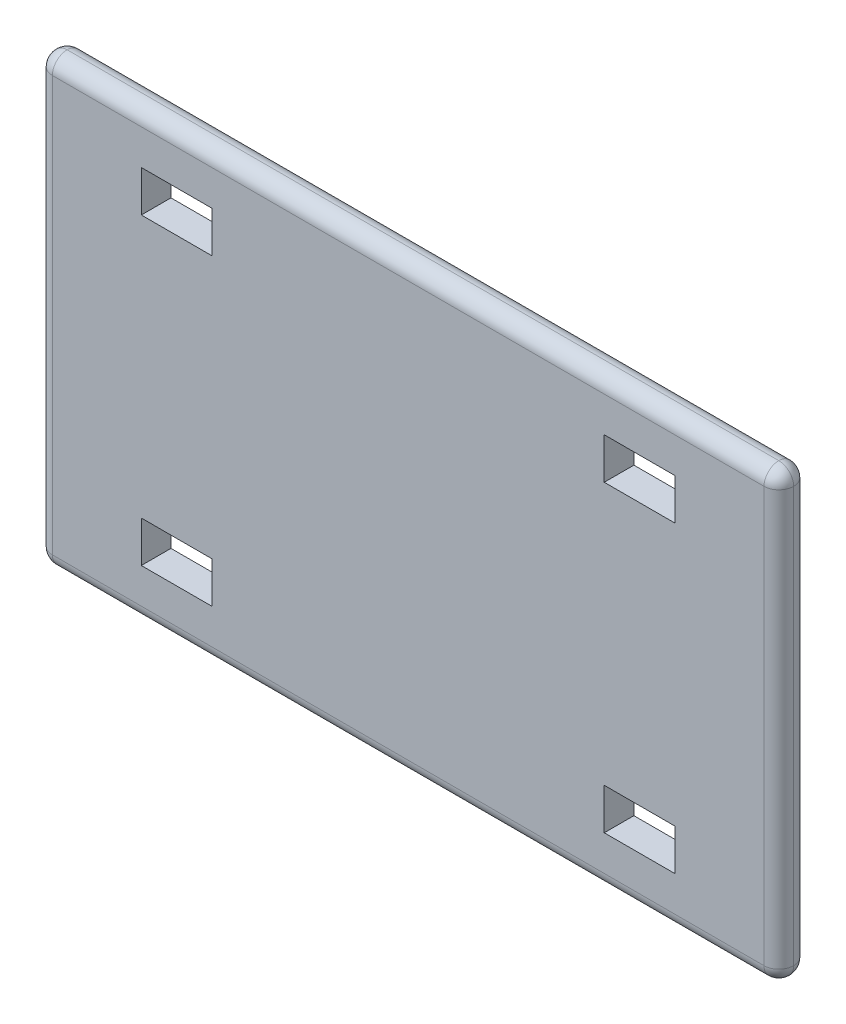
ISO-10303-21;
HEADER;
FILE_DESCRIPTION(('STEP AP214'),'2;1');
FILE_NAME('part.step','',(''),(''),'','','');
FILE_SCHEMA(('AUTOMOTIVE_DESIGN { 1 0 10303 214 1 1 1 1 }'));
ENDSEC;
DATA;
#1=APPLICATION_CONTEXT('core data for automotive mechanical design processes');
#2=APPLICATION_PROTOCOL_DEFINITION('international standard','automotive_design',2000,#1);
#3=PRODUCT_CONTEXT('',#1,'mechanical');
#4=PRODUCT('Part','Part','',(#3));
#5=PRODUCT_RELATED_PRODUCT_CATEGORY('part','',(#4));
#6=PRODUCT_DEFINITION_FORMATION('','',#4);
#7=PRODUCT_DEFINITION_CONTEXT('part definition',#1,'design');
#8=PRODUCT_DEFINITION('design','',#6,#7);
#9=PRODUCT_DEFINITION_SHAPE('','',#8);
#10=(LENGTH_UNIT() NAMED_UNIT(*) SI_UNIT(.MILLI.,.METRE.));
#11=(NAMED_UNIT(*) PLANE_ANGLE_UNIT() SI_UNIT($,.RADIAN.));
#12=(NAMED_UNIT(*) SI_UNIT($,.STERADIAN.) SOLID_ANGLE_UNIT());
#13=UNCERTAINTY_MEASURE_WITH_UNIT(LENGTH_MEASURE(1.E-05),#10,'distance_accuracy_value','');
#14=(GEOMETRIC_REPRESENTATION_CONTEXT(3) GLOBAL_UNCERTAINTY_ASSIGNED_CONTEXT((#13)) GLOBAL_UNIT_ASSIGNED_CONTEXT((#10,
#11,#12)) REPRESENTATION_CONTEXT('',''));
#15=CARTESIAN_POINT('',(0.,0.,0.));
#16=DIRECTION('',(0.,0.,1.));
#17=DIRECTION('',(1.,0.,0.));
#18=AXIS2_PLACEMENT_3D('',#15,#16,#17);
#19=CARTESIAN_POINT('',(0.,0.,0.8));
#20=DIRECTION('',(0.,0.,1.));
#21=DIRECTION('',(1.,0.,0.));
#22=AXIS2_PLACEMENT_3D('',#19,#20,#21);
#23=PLANE('',#22);
#24=DIRECTION('',(-1.,0.,0.));
#25=VECTOR('',#24,1.);
#26=CARTESIAN_POINT('',(6.25703296703297,-6.1445054945055,0.8));
#27=LINE('',#26,#25);
#28=CARTESIAN_POINT('',(8.16703296703297,-6.1445054945055,0.8));
#29=VERTEX_POINT('',#28);
#30=CARTESIAN_POINT('',(6.25703296703297,-6.1445054945055,0.8));
#31=VERTEX_POINT('',#30);
#32=EDGE_CURVE('E301',#29,#31,#27,.T.);
#33=ORIENTED_EDGE('',*,*,#32,.T.);
#34=DIRECTION('',(0.,1.,0.));
#35=VECTOR('',#34,1.);
#36=CARTESIAN_POINT('',(6.25703296703297,-5.0345054945055,0.8));
#37=LINE('',#36,#35);
#38=CARTESIAN_POINT('',(6.25703296703297,-5.0345054945055,0.8));
#39=VERTEX_POINT('',#38);
#40=EDGE_CURVE('E305',#31,#39,#37,.T.);
#41=ORIENTED_EDGE('',*,*,#40,.T.);
#42=DIRECTION('',(1.,0.,0.));
#43=VECTOR('',#42,1.);
#44=CARTESIAN_POINT('',(8.16703296703297,-5.0345054945055,0.8));
#45=LINE('',#44,#43);
#46=CARTESIAN_POINT('',(8.16703296703297,-5.0345054945055,0.8));
#47=VERTEX_POINT('',#46);
#48=EDGE_CURVE('E57',#39,#47,#45,.T.);
#49=ORIENTED_EDGE('',*,*,#48,.T.);
#50=DIRECTION('',(0.,-1.,0.));
#51=VECTOR('',#50,1.);
#52=CARTESIAN_POINT('',(8.16703296703297,-6.1445054945055,0.8));
#53=LINE('',#52,#51);
#54=EDGE_CURVE('E312',#47,#29,#53,.T.);
#55=ORIENTED_EDGE('',*,*,#54,.T.);
#56=EDGE_LOOP('',(#33,#41,#49,#55));
#57=FACE_BOUND('',#56,.T.);
#58=DIRECTION('',(0.,1.,0.));
#59=VECTOR('',#58,1.);
#60=CARTESIAN_POINT('',(-6.23296703296703,-5.0345054945055,0.8));
#61=LINE('',#60,#59);
#62=CARTESIAN_POINT('',(-6.23296703296703,-6.1445054945055,0.8));
#63=VERTEX_POINT('',#62);
#64=CARTESIAN_POINT('',(-6.23296703296703,-5.0345054945055,0.8));
#65=VERTEX_POINT('',#64);
#66=EDGE_CURVE('E259',#63,#65,#61,.T.);
#67=ORIENTED_EDGE('',*,*,#66,.T.);
#68=DIRECTION('',(1.,0.,0.));
#69=VECTOR('',#68,1.);
#70=CARTESIAN_POINT('',(-4.32296703296703,-5.0345054945055,0.8));
#71=LINE('',#70,#69);
#72=CARTESIAN_POINT('',(-4.32296703296703,-5.0345054945055,0.8));
#73=VERTEX_POINT('',#72);
#74=EDGE_CURVE('E263',#65,#73,#71,.T.);
#75=ORIENTED_EDGE('',*,*,#74,.T.);
#76=DIRECTION('',(0.,-1.,0.));
#77=VECTOR('',#76,1.);
#78=CARTESIAN_POINT('',(-4.32296703296703,-6.1445054945055,0.8));
#79=LINE('',#78,#77);
#80=CARTESIAN_POINT('',(-4.32296703296703,-6.1445054945055,0.8));
#81=VERTEX_POINT('',#80);
#82=EDGE_CURVE('E65',#73,#81,#79,.T.);
#83=ORIENTED_EDGE('',*,*,#82,.T.);
#84=DIRECTION('',(-1.,0.,0.));
#85=VECTOR('',#84,1.);
#86=CARTESIAN_POINT('',(-6.23296703296703,-6.1445054945055,0.8));
#87=LINE('',#86,#85);
#88=EDGE_CURVE('E270',#81,#63,#87,.T.);
#89=ORIENTED_EDGE('',*,*,#88,.T.);
#90=EDGE_LOOP('',(#67,#75,#83,#89));
#91=FACE_BOUND('',#90,.T.);
#92=DIRECTION('',(0.,1.,0.));
#93=VECTOR('',#92,1.);
#94=CARTESIAN_POINT('',(-6.23296703296703,3.15549450549451,0.8));
#95=LINE('',#94,#93);
#96=CARTESIAN_POINT('',(-6.23296703296703,2.04549450549451,0.8));
#97=VERTEX_POINT('',#96);
#98=CARTESIAN_POINT('',(-6.23296703296703,3.15549450549451,0.8));
#99=VERTEX_POINT('',#98);
#100=EDGE_CURVE('E207',#97,#99,#95,.T.);
#101=ORIENTED_EDGE('',*,*,#100,.T.);
#102=DIRECTION('',(1.,0.,0.));
#103=VECTOR('',#102,1.);
#104=CARTESIAN_POINT('',(-6.23296703296703,3.15549450549451,0.8));
#105=LINE('',#104,#103);
#106=CARTESIAN_POINT('',(-4.32296703296703,3.15549450549451,0.8));
#107=VERTEX_POINT('',#106);
#108=EDGE_CURVE('E220',#99,#107,#105,.T.);
#109=ORIENTED_EDGE('',*,*,#108,.T.);
#110=DIRECTION('',(0.,-1.,0.));
#111=VECTOR('',#110,1.);
#112=CARTESIAN_POINT('',(-4.32296703296703,2.04549450549451,0.8));
#113=LINE('',#112,#111);
#114=CARTESIAN_POINT('',(-4.32296703296703,2.04549450549451,0.8));
#115=VERTEX_POINT('',#114);
#116=EDGE_CURVE('E225',#107,#115,#113,.T.);
#117=ORIENTED_EDGE('',*,*,#116,.T.);
#118=DIRECTION('',(-1.,0.,0.));
#119=VECTOR('',#118,1.);
#120=CARTESIAN_POINT('',(-6.23296703296703,2.04549450549451,0.8));
#121=LINE('',#120,#119);
#122=EDGE_CURVE('E216',#115,#97,#121,.T.);
#123=ORIENTED_EDGE('',*,*,#122,.T.);
#124=EDGE_LOOP('',(#101,#109,#117,#123));
#125=FACE_BOUND('',#124,.T.);
#126=DIRECTION('',(0.,1.,0.));
#127=VECTOR('',#126,1.);
#128=CARTESIAN_POINT('',(6.25703296703297,2.04549450549451,0.8));
#129=LINE('',#128,#127);
#130=CARTESIAN_POINT('',(6.25703296703297,2.04549450549451,0.8));
#131=VERTEX_POINT('',#130);
#132=CARTESIAN_POINT('',(6.25703296703297,3.15549450549451,0.8));
#133=VERTEX_POINT('',#132);
#134=EDGE_CURVE('E342',#131,#133,#129,.T.);
#135=ORIENTED_EDGE('',*,*,#134,.T.);
#136=DIRECTION('',(1.,0.,0.));
#137=VECTOR('',#136,1.);
#138=CARTESIAN_POINT('',(6.25703296703297,3.15549450549451,0.8));
#139=LINE('',#138,#137);
#140=CARTESIAN_POINT('',(8.16703296703297,3.1554945054945,0.8));
#141=VERTEX_POINT('',#140);
#142=EDGE_CURVE('E346',#133,#141,#139,.T.);
#143=ORIENTED_EDGE('',*,*,#142,.T.);
#144=DIRECTION('',(0.,-1.,0.));
#145=VECTOR('',#144,1.);
#146=CARTESIAN_POINT('',(8.16703296703297,3.1554945054945,0.8));
#147=LINE('',#146,#145);
#148=CARTESIAN_POINT('',(8.16703296703297,2.04549450549451,0.8));
#149=VERTEX_POINT('',#148);
#150=EDGE_CURVE('E351',#141,#149,#147,.T.);
#151=ORIENTED_EDGE('',*,*,#150,.T.);
#152=DIRECTION('',(-1.,0.,0.));
#153=VECTOR('',#152,1.);
#154=CARTESIAN_POINT('',(8.16703296703297,2.04549450549451,0.8));
#155=LINE('',#154,#153);
#156=EDGE_CURVE('E355',#149,#131,#155,.T.);
#157=ORIENTED_EDGE('',*,*,#156,.T.);
#158=EDGE_LOOP('',(#135,#143,#151,#157));
#159=FACE_BOUND('',#158,.T.);
#160=DIRECTION('',(0.,1.,0.));
#161=VECTOR('',#160,1.);
#162=CARTESIAN_POINT('',(10.567032967033,4.5054945054945,0.8));
#163=LINE('',#162,#161);
#164=CARTESIAN_POINT('',(10.567032967033,-7.0945054945055,0.8));
#165=VERTEX_POINT('',#164);
#166=CARTESIAN_POINT('',(10.567032967033,4.1054945054945,0.8));
#167=VERTEX_POINT('',#166);
#168=EDGE_CURVE('E392',#165,#167,#163,.T.);
#169=ORIENTED_EDGE('',*,*,#168,.T.);
#170=DIRECTION('',(-1.,0.,0.));
#171=VECTOR('',#170,1.);
#172=CARTESIAN_POINT('',(-9.03296703296703,4.1054945054945,0.8));
#173=LINE('',#172,#171);
#174=CARTESIAN_POINT('',(-8.63296703296703,4.1054945054945,0.8));
#175=VERTEX_POINT('',#174);
#176=EDGE_CURVE('E395',#167,#175,#173,.T.);
#177=ORIENTED_EDGE('',*,*,#176,.T.);
#178=DIRECTION('',(0.,-1.,0.));
#179=VECTOR('',#178,1.);
#180=CARTESIAN_POINT('',(-8.63296703296703,-7.4945054945055,0.8));
#181=LINE('',#180,#179);
#182=CARTESIAN_POINT('',(-8.63296703296703,-7.0945054945055,0.8));
#183=VERTEX_POINT('',#182);
#184=EDGE_CURVE('E389',#175,#183,#181,.T.);
#185=ORIENTED_EDGE('',*,*,#184,.T.);
#186=DIRECTION('',(1.,0.,0.));
#187=VECTOR('',#186,1.);
#188=CARTESIAN_POINT('',(10.967032967033,-7.0945054945055,0.8));
#189=LINE('',#188,#187);
#190=EDGE_CURVE('E386',#183,#165,#189,.T.);
#191=ORIENTED_EDGE('',*,*,#190,.T.);
#192=EDGE_LOOP('',(#169,#177,#185,#191));
#193=FACE_BOUND('',#192,.T.);
#194=ADVANCED_FACE('F39',(#57,#91,#125,#159,#193),#23,.T.);
#195=CARTESIAN_POINT('',(0.,0.,0.));
#196=DIRECTION('',(0.,0.,1.));
#197=DIRECTION('',(1.,0.,0.));
#198=AXIS2_PLACEMENT_3D('',#195,#196,#197);
#199=PLANE('',#198);
#200=DIRECTION('',(0.,1.,0.));
#201=VECTOR('',#200,1.);
#202=CARTESIAN_POINT('',(6.25703296703297,-5.0345054945055,0.));
#203=LINE('',#202,#201);
#204=CARTESIAN_POINT('',(6.25703296703297,-6.1445054945055,0.));
#205=VERTEX_POINT('',#204);
#206=CARTESIAN_POINT('',(6.25703296703297,-5.0345054945055,0.));
#207=VERTEX_POINT('',#206);
#208=EDGE_CURVE('E320',#205,#207,#203,.T.);
#209=ORIENTED_EDGE('',*,*,#208,.F.);
#210=DIRECTION('',(-1.,0.,0.));
#211=VECTOR('',#210,1.);
#212=CARTESIAN_POINT('',(6.25703296703297,-6.1445054945055,0.));
#213=LINE('',#212,#211);
#214=CARTESIAN_POINT('',(8.16703296703297,-6.1445054945055,0.));
#215=VERTEX_POINT('',#214);
#216=EDGE_CURVE('E317',#215,#205,#213,.T.);
#217=ORIENTED_EDGE('',*,*,#216,.F.);
#218=DIRECTION('',(0.,-1.,0.));
#219=VECTOR('',#218,1.);
#220=CARTESIAN_POINT('',(8.16703296703297,-6.1445054945055,0.));
#221=LINE('',#220,#219);
#222=CARTESIAN_POINT('',(8.16703296703297,-5.0345054945055,0.));
#223=VERTEX_POINT('',#222);
#224=EDGE_CURVE('E306',#223,#215,#221,.T.);
#225=ORIENTED_EDGE('',*,*,#224,.F.);
#226=DIRECTION('',(1.,0.,0.));
#227=VECTOR('',#226,1.);
#228=CARTESIAN_POINT('',(8.16703296703297,-5.0345054945055,0.));
#229=LINE('',#228,#227);
#230=EDGE_CURVE('E324',#207,#223,#229,.T.);
#231=ORIENTED_EDGE('',*,*,#230,.F.);
#232=EDGE_LOOP('',(#209,#217,#225,#231));
#233=FACE_BOUND('',#232,.T.);
#234=DIRECTION('',(1.,0.,0.));
#235=VECTOR('',#234,1.);
#236=CARTESIAN_POINT('',(-4.32296703296703,-5.0345054945055,0.));
#237=LINE('',#236,#235);
#238=CARTESIAN_POINT('',(-6.23296703296703,-5.0345054945055,0.));
#239=VERTEX_POINT('',#238);
#240=CARTESIAN_POINT('',(-4.32296703296703,-5.0345054945055,0.));
#241=VERTEX_POINT('',#240);
#242=EDGE_CURVE('E278',#239,#241,#237,.T.);
#243=ORIENTED_EDGE('',*,*,#242,.F.);
#244=DIRECTION('',(0.,1.,0.));
#245=VECTOR('',#244,1.);
#246=CARTESIAN_POINT('',(-6.23296703296703,-5.0345054945055,0.));
#247=LINE('',#246,#245);
#248=CARTESIAN_POINT('',(-6.23296703296703,-6.1445054945055,0.));
#249=VERTEX_POINT('',#248);
#250=EDGE_CURVE('E275',#249,#239,#247,.T.);
#251=ORIENTED_EDGE('',*,*,#250,.F.);
#252=DIRECTION('',(-1.,0.,0.));
#253=VECTOR('',#252,1.);
#254=CARTESIAN_POINT('',(-6.23296703296703,-6.1445054945055,0.));
#255=LINE('',#254,#253);
#256=CARTESIAN_POINT('',(-4.32296703296703,-6.1445054945055,0.));
#257=VERTEX_POINT('',#256);
#258=EDGE_CURVE('E264',#257,#249,#255,.T.);
#259=ORIENTED_EDGE('',*,*,#258,.F.);
#260=DIRECTION('',(0.,-1.,0.));
#261=VECTOR('',#260,1.);
#262=CARTESIAN_POINT('',(-4.32296703296703,-6.1445054945055,0.));
#263=LINE('',#262,#261);
#264=EDGE_CURVE('E283',#241,#257,#263,.T.);
#265=ORIENTED_EDGE('',*,*,#264,.F.);
#266=EDGE_LOOP('',(#243,#251,#259,#265));
#267=FACE_BOUND('',#266,.T.);
#268=DIRECTION('',(1.,0.,0.));
#269=VECTOR('',#268,1.);
#270=CARTESIAN_POINT('',(-6.23296703296703,3.15549450549451,0.));
#271=LINE('',#270,#269);
#272=CARTESIAN_POINT('',(-6.23296703296703,3.15549450549451,0.));
#273=VERTEX_POINT('',#272);
#274=CARTESIAN_POINT('',(-4.32296703296703,3.15549450549451,0.));
#275=VERTEX_POINT('',#274);
#276=EDGE_CURVE('E243',#273,#275,#271,.T.);
#277=ORIENTED_EDGE('',*,*,#276,.F.);
#278=DIRECTION('',(0.,1.,0.));
#279=VECTOR('',#278,1.);
#280=CARTESIAN_POINT('',(-6.23296703296703,3.15549450549451,0.));
#281=LINE('',#280,#279);
#282=CARTESIAN_POINT('',(-6.23296703296703,2.04549450549451,0.));
#283=VERTEX_POINT('',#282);
#284=EDGE_CURVE('E210',#283,#273,#281,.T.);
#285=ORIENTED_EDGE('',*,*,#284,.F.);
#286=DIRECTION('',(-1.,0.,0.));
#287=VECTOR('',#286,1.);
#288=CARTESIAN_POINT('',(-6.23296703296703,2.04549450549451,0.));
#289=LINE('',#288,#287);
#290=CARTESIAN_POINT('',(-4.32296703296703,2.04549450549451,0.));
#291=VERTEX_POINT('',#290);
#292=EDGE_CURVE('E230',#291,#283,#289,.T.);
#293=ORIENTED_EDGE('',*,*,#292,.F.);
#294=DIRECTION('',(0.,-1.,0.));
#295=VECTOR('',#294,1.);
#296=CARTESIAN_POINT('',(-4.32296703296703,2.04549450549451,0.));
#297=LINE('',#296,#295);
#298=EDGE_CURVE('E234',#275,#291,#297,.T.);
#299=ORIENTED_EDGE('',*,*,#298,.F.);
#300=EDGE_LOOP('',(#277,#285,#293,#299));
#301=FACE_BOUND('',#300,.T.);
#302=DIRECTION('',(1.,0.,0.));
#303=VECTOR('',#302,1.);
#304=CARTESIAN_POINT('',(6.25703296703297,3.15549450549451,0.));
#305=LINE('',#304,#303);
#306=CARTESIAN_POINT('',(6.25703296703297,3.15549450549451,0.));
#307=VERTEX_POINT('',#306);
#308=CARTESIAN_POINT('',(8.16703296703297,3.1554945054945,0.));
#309=VERTEX_POINT('',#308);
#310=EDGE_CURVE('E362',#307,#309,#305,.T.);
#311=ORIENTED_EDGE('',*,*,#310,.F.);
#312=DIRECTION('',(0.,1.,0.));
#313=VECTOR('',#312,1.);
#314=CARTESIAN_POINT('',(6.25703296703297,2.04549450549451,0.));
#315=LINE('',#314,#313);
#316=CARTESIAN_POINT('',(6.25703296703297,2.04549450549451,0.));
#317=VERTEX_POINT('',#316);
#318=EDGE_CURVE('E253',#317,#307,#315,.T.);
#319=ORIENTED_EDGE('',*,*,#318,.F.);
#320=DIRECTION('',(-1.,0.,0.));
#321=VECTOR('',#320,1.);
#322=CARTESIAN_POINT('',(8.16703296703297,2.04549450549451,0.));
#323=LINE('',#322,#321);
#324=CARTESIAN_POINT('',(8.16703296703297,2.04549450549451,0.));
#325=VERTEX_POINT('',#324);
#326=EDGE_CURVE('E347',#325,#317,#323,.T.);
#327=ORIENTED_EDGE('',*,*,#326,.F.);
#328=DIRECTION('',(0.,-1.,0.));
#329=VECTOR('',#328,1.);
#330=CARTESIAN_POINT('',(8.16703296703297,3.1554945054945,0.));
#331=LINE('',#330,#329);
#332=EDGE_CURVE('E366',#309,#325,#331,.T.);
#333=ORIENTED_EDGE('',*,*,#332,.F.);
#334=EDGE_LOOP('',(#311,#319,#327,#333));
#335=FACE_BOUND('',#334,.T.);
#336=DIRECTION('',(-1.,0.,0.));
#337=VECTOR('',#336,1.);
#338=CARTESIAN_POINT('',(0.,4.1054945054945,0.));
#339=LINE('',#338,#337);
#340=CARTESIAN_POINT('',(-8.63296703296703,4.1054945054945,0.));
#341=VERTEX_POINT('',#340);
#342=CARTESIAN_POINT('',(10.567032967033,4.1054945054945,0.));
#343=VERTEX_POINT('',#342);
#344=EDGE_CURVE('E49',#341,#343,#339,.F.);
#345=ORIENTED_EDGE('',*,*,#344,.T.);
#346=DIRECTION('',(0.,1.,0.));
#347=VECTOR('',#346,1.);
#348=CARTESIAN_POINT('',(10.567032967033,0.,0.));
#349=LINE('',#348,#347);
#350=CARTESIAN_POINT('',(10.567032967033,-7.0945054945055,0.));
#351=VERTEX_POINT('',#350);
#352=EDGE_CURVE('E11',#343,#351,#349,.F.);
#353=ORIENTED_EDGE('',*,*,#352,.T.);
#354=DIRECTION('',(1.,0.,0.));
#355=VECTOR('',#354,1.);
#356=CARTESIAN_POINT('',(0.,-7.0945054945055,0.));
#357=LINE('',#356,#355);
#358=CARTESIAN_POINT('',(-8.63296703296703,-7.0945054945055,0.));
#359=VERTEX_POINT('',#358);
#360=EDGE_CURVE('E399',#351,#359,#357,.F.);
#361=ORIENTED_EDGE('',*,*,#360,.T.);
#362=DIRECTION('',(0.,-1.,0.));
#363=VECTOR('',#362,1.);
#364=CARTESIAN_POINT('',(-8.63296703296703,0.,0.));
#365=LINE('',#364,#363);
#366=EDGE_CURVE('E402',#359,#341,#365,.F.);
#367=ORIENTED_EDGE('',*,*,#366,.T.);
#368=EDGE_LOOP('',(#345,#353,#361,#367));
#369=FACE_BOUND('',#368,.T.);
#370=ADVANCED_FACE('F507',(#233,#267,#301,#335,#369),#199,.F.);
#371=CARTESIAN_POINT('',(-9.03296703296703,-7.0945054945055,0.4));
#372=DIRECTION('',(1.,0.,0.));
#373=DIRECTION('',(0.,0.,-1.));
#374=AXIS2_PLACEMENT_3D('',#371,#372,#373);
#375=CYLINDRICAL_SURFACE('',#374,0.4);
#376=CARTESIAN_POINT('',(10.567032967033,-7.0945054945055,0.4));
#377=DIRECTION('',(1.,0.,0.));
#378=DIRECTION('',(0.,0.,-1.));
#379=AXIS2_PLACEMENT_3D('',#376,#377,#378);
#380=CIRCLE('',#379,0.4);
#381=CARTESIAN_POINT('',(10.567032967033,-7.4945054945055,0.4));
#382=VERTEX_POINT('',#381);
#383=EDGE_CURVE('E43',#382,#351,#380,.T.);
#384=ORIENTED_EDGE('',*,*,#383,.F.);
#385=DIRECTION('',(1.,0.,0.));
#386=VECTOR('',#385,1.);
#387=CARTESIAN_POINT('',(-9.03296703296703,-7.4945054945055,0.4));
#388=LINE('',#387,#386);
#389=CARTESIAN_POINT('',(-8.63296703296703,-7.4945054945055,0.4));
#390=VERTEX_POINT('',#389);
#391=EDGE_CURVE('E487',#390,#382,#388,.T.);
#392=ORIENTED_EDGE('',*,*,#391,.F.);
#393=CARTESIAN_POINT('',(-8.63296703296703,-7.0945054945055,0.4));
#394=DIRECTION('',(-1.,0.,0.));
#395=DIRECTION('',(0.,0.,1.));
#396=AXIS2_PLACEMENT_3D('',#393,#394,#395);
#397=CIRCLE('',#396,0.4);
#398=EDGE_CURVE('E483',#359,#390,#397,.T.);
#399=ORIENTED_EDGE('',*,*,#398,.F.);
#400=ORIENTED_EDGE('',*,*,#360,.F.);
#401=EDGE_LOOP('',(#384,#392,#399,#400));
#402=FACE_BOUND('',#401,.T.);
#403=ADVANCED_FACE('F41',(#402),#375,.T.);
#404=CARTESIAN_POINT('',(10.567032967033,-7.0945054945055,0.4));
#405=DIRECTION('',(0.,0.,1.));
#406=DIRECTION('',(1.,0.,0.));
#407=AXIS2_PLACEMENT_3D('',#404,#405,#406);
#408=SPHERICAL_SURFACE('',#407,0.4);
#409=CARTESIAN_POINT('',(10.567032967033,-7.0945054945055,0.4));
#410=DIRECTION('',(0.,0.,-1.));
#411=DIRECTION('',(-1.,0.,0.));
#412=AXIS2_PLACEMENT_3D('',#409,#410,#411);
#413=CIRCLE('',#412,0.4);
#414=CARTESIAN_POINT('',(10.967032967033,-7.0945054945055,0.4));
#415=VERTEX_POINT('',#414);
#416=EDGE_CURVE('E490',#382,#415,#413,.F.);
#417=ORIENTED_EDGE('',*,*,#416,.F.);
#418=ORIENTED_EDGE('',*,*,#383,.T.);
#419=CARTESIAN_POINT('',(10.567032967033,-7.0945054945055,0.4));
#420=DIRECTION('',(0.,-1.,0.));
#421=DIRECTION('',(1.,0.,0.));
#422=AXIS2_PLACEMENT_3D('',#419,#420,#421);
#423=CIRCLE('',#422,0.4);
#424=EDGE_CURVE('E480',#415,#351,#423,.F.);
#425=ORIENTED_EDGE('',*,*,#424,.F.);
#426=EDGE_LOOP('',(#417,#418,#425));
#427=FACE_BOUND('',#426,.T.);
#428=ADVANCED_FACE('F501',(#427),#408,.T.);
#429=CARTESIAN_POINT('',(0.,-7.0945054945055,0.4));
#430=DIRECTION('',(-1.,0.,0.));
#431=DIRECTION('',(0.,0.,1.));
#432=AXIS2_PLACEMENT_3D('',#429,#430,#431);
#433=CYLINDRICAL_SURFACE('',#432,0.4);
#434=CARTESIAN_POINT('',(-8.63296703296703,-7.0945054945055,0.4));
#435=DIRECTION('',(-1.,0.,0.));
#436=DIRECTION('',(0.,0.,1.));
#437=AXIS2_PLACEMENT_3D('',#434,#435,#436);
#438=CIRCLE('',#437,0.4);
#439=EDGE_CURVE('E472',#390,#183,#438,.T.);
#440=ORIENTED_EDGE('',*,*,#439,.F.);
#441=ORIENTED_EDGE('',*,*,#391,.T.);
#442=CARTESIAN_POINT('',(10.567032967033,-7.0945054945055,0.4));
#443=DIRECTION('',(1.,0.,0.));
#444=DIRECTION('',(0.,0.,-1.));
#445=AXIS2_PLACEMENT_3D('',#442,#443,#444);
#446=CIRCLE('',#445,0.4);
#447=EDGE_CURVE('E476',#165,#382,#446,.T.);
#448=ORIENTED_EDGE('',*,*,#447,.F.);
#449=ORIENTED_EDGE('',*,*,#190,.F.);
#450=EDGE_LOOP('',(#440,#441,#448,#449));
#451=FACE_BOUND('',#450,.T.);
#452=ADVANCED_FACE('F534',(#451),#433,.T.);
#453=CARTESIAN_POINT('',(-8.63296703296703,-7.0945054945055,0.4));
#454=DIRECTION('',(0.,0.,1.));
#455=DIRECTION('',(1.,0.,0.));
#456=AXIS2_PLACEMENT_3D('',#453,#454,#455);
#457=SPHERICAL_SURFACE('',#456,0.4);
#458=ORIENTED_EDGE('',*,*,#398,.T.);
#459=CARTESIAN_POINT('',(-8.63296703296703,-7.0945054945055,0.4));
#460=DIRECTION('',(0.,0.,1.));
#461=DIRECTION('',(1.,0.,0.));
#462=AXIS2_PLACEMENT_3D('',#459,#460,#461);
#463=CIRCLE('',#462,0.4);
#464=CARTESIAN_POINT('',(-9.03296703296703,-7.0945054945055,0.4));
#465=VERTEX_POINT('',#464);
#466=EDGE_CURVE('E468',#465,#390,#463,.T.);
#467=ORIENTED_EDGE('',*,*,#466,.F.);
#468=CARTESIAN_POINT('',(-8.63296703296703,-7.0945054945055,0.4));
#469=DIRECTION('',(0.,-1.,0.));
#470=DIRECTION('',(0.,0.,-1.));
#471=AXIS2_PLACEMENT_3D('',#468,#469,#470);
#472=CIRCLE('',#471,0.4);
#473=EDGE_CURVE('E464',#359,#465,#472,.F.);
#474=ORIENTED_EDGE('',*,*,#473,.F.);
#475=EDGE_LOOP('',(#458,#467,#474));
#476=FACE_BOUND('',#475,.T.);
#477=ADVANCED_FACE('F539',(#476),#457,.T.);
#478=CARTESIAN_POINT('',(10.567032967033,4.5054945054945,0.4));
#479=DIRECTION('',(0.,1.,0.));
#480=DIRECTION('',(0.,0.,1.));
#481=AXIS2_PLACEMENT_3D('',#478,#479,#480);
#482=CYLINDRICAL_SURFACE('',#481,0.4);
#483=ORIENTED_EDGE('',*,*,#424,.T.);
#484=ORIENTED_EDGE('',*,*,#352,.F.);
#485=CARTESIAN_POINT('',(10.567032967033,4.1054945054945,0.4));
#486=DIRECTION('',(0.,1.,0.));
#487=DIRECTION('',(0.,0.,1.));
#488=AXIS2_PLACEMENT_3D('',#485,#486,#487);
#489=CIRCLE('',#488,0.4);
#490=CARTESIAN_POINT('',(10.967032967033,4.1054945054945,0.4));
#491=VERTEX_POINT('',#490);
#492=EDGE_CURVE('E457',#491,#343,#489,.T.);
#493=ORIENTED_EDGE('',*,*,#492,.F.);
#494=DIRECTION('',(0.,1.,0.));
#495=VECTOR('',#494,1.);
#496=CARTESIAN_POINT('',(10.967032967033,4.5054945054945,0.4));
#497=LINE('',#496,#495);
#498=EDGE_CURVE('E449',#415,#491,#497,.T.);
#499=ORIENTED_EDGE('',*,*,#498,.F.);
#500=EDGE_LOOP('',(#483,#484,#493,#499));
#501=FACE_BOUND('',#500,.T.);
#502=ADVANCED_FACE('F510',(#501),#482,.T.);
#503=CARTESIAN_POINT('',(10.567032967033,-7.0945054945055,0.4));
#504=DIRECTION('',(0.,0.,1.));
#505=DIRECTION('',(1.,0.,0.));
#506=AXIS2_PLACEMENT_3D('',#503,#504,#505);
#507=SPHERICAL_SURFACE('',#506,0.4);
#508=ORIENTED_EDGE('',*,*,#447,.T.);
#509=ORIENTED_EDGE('',*,*,#416,.T.);
#510=CARTESIAN_POINT('',(10.567032967033,-7.0945054945055,0.4));
#511=DIRECTION('',(0.,-1.,0.));
#512=DIRECTION('',(0.,0.,-1.));
#513=AXIS2_PLACEMENT_3D('',#510,#511,#512);
#514=CIRCLE('',#513,0.4);
#515=EDGE_CURVE('E445',#165,#415,#514,.F.);
#516=ORIENTED_EDGE('',*,*,#515,.F.);
#517=EDGE_LOOP('',(#508,#509,#516));
#518=FACE_BOUND('',#517,.T.);
#519=ADVANCED_FACE('F529',(#518),#507,.T.);
#520=CARTESIAN_POINT('',(-8.63296703296703,-7.0945054945055,0.4));
#521=DIRECTION('',(0.,0.,1.));
#522=DIRECTION('',(1.,0.,0.));
#523=AXIS2_PLACEMENT_3D('',#520,#521,#522);
#524=SPHERICAL_SURFACE('',#523,0.4);
#525=ORIENTED_EDGE('',*,*,#466,.T.);
#526=ORIENTED_EDGE('',*,*,#439,.T.);
#527=CARTESIAN_POINT('',(-8.63296703296703,-7.0945054945055,0.4));
#528=DIRECTION('',(0.,-1.,0.));
#529=DIRECTION('',(0.,0.,-1.));
#530=AXIS2_PLACEMENT_3D('',#527,#528,#529);
#531=CIRCLE('',#530,0.4);
#532=EDGE_CURVE('E441',#465,#183,#531,.F.);
#533=ORIENTED_EDGE('',*,*,#532,.F.);
#534=EDGE_LOOP('',(#525,#526,#533));
#535=FACE_BOUND('',#534,.T.);
#536=ADVANCED_FACE('F537',(#535),#524,.T.);
#537=CARTESIAN_POINT('',(-8.63296703296703,4.5054945054945,0.4));
#538=DIRECTION('',(0.,-1.,0.));
#539=DIRECTION('',(1.,0.,0.));
#540=AXIS2_PLACEMENT_3D('',#537,#538,#539);
#541=CYLINDRICAL_SURFACE('',#540,0.4);
#542=CARTESIAN_POINT('',(-8.63296703296703,4.1054945054945,0.4));
#543=DIRECTION('',(0.,1.,0.));
#544=DIRECTION('',(0.,0.,1.));
#545=AXIS2_PLACEMENT_3D('',#542,#543,#544);
#546=CIRCLE('',#545,0.4);
#547=CARTESIAN_POINT('',(-9.03296703296703,4.1054945054945,0.4));
#548=VERTEX_POINT('',#547);
#549=EDGE_CURVE('E461',#341,#548,#546,.T.);
#550=ORIENTED_EDGE('',*,*,#549,.F.);
#551=ORIENTED_EDGE('',*,*,#366,.F.);
#552=ORIENTED_EDGE('',*,*,#473,.T.);
#553=DIRECTION('',(0.,-1.,0.));
#554=VECTOR('',#553,1.);
#555=CARTESIAN_POINT('',(-9.03296703296703,4.5054945054945,0.4));
#556=LINE('',#555,#554);
#557=EDGE_CURVE('E437',#548,#465,#556,.T.);
#558=ORIENTED_EDGE('',*,*,#557,.F.);
#559=EDGE_LOOP('',(#550,#551,#552,#558));
#560=FACE_BOUND('',#559,.T.);
#561=ADVANCED_FACE('F544',(#560),#541,.T.);
#562=CARTESIAN_POINT('',(-8.63296703296703,4.1054945054945,0.4));
#563=DIRECTION('',(0.,0.,1.));
#564=DIRECTION('',(1.,0.,0.));
#565=AXIS2_PLACEMENT_3D('',#562,#563,#564);
#566=SPHERICAL_SURFACE('',#565,0.4);
#567=CARTESIAN_POINT('',(-8.63296703296703,4.1054945054945,0.4));
#568=DIRECTION('',(-1.,0.,0.));
#569=DIRECTION('',(0.,0.,1.));
#570=AXIS2_PLACEMENT_3D('',#567,#568,#569);
#571=CIRCLE('',#570,0.4);
#572=CARTESIAN_POINT('',(-8.63296703296703,4.5054945054945,0.4));
#573=VERTEX_POINT('',#572);
#574=EDGE_CURVE('E429',#341,#573,#571,.F.);
#575=ORIENTED_EDGE('',*,*,#574,.F.);
#576=ORIENTED_EDGE('',*,*,#549,.T.);
#577=CARTESIAN_POINT('',(-8.63296703296703,4.1054945054945,0.4));
#578=DIRECTION('',(0.,0.,-1.));
#579=DIRECTION('',(-1.,0.,0.));
#580=AXIS2_PLACEMENT_3D('',#577,#578,#579);
#581=CIRCLE('',#580,0.4);
#582=EDGE_CURVE('E433',#573,#548,#581,.F.);
#583=ORIENTED_EDGE('',*,*,#582,.F.);
#584=EDGE_LOOP('',(#575,#576,#583));
#585=FACE_BOUND('',#584,.T.);
#586=ADVANCED_FACE('F547',(#585),#566,.T.);
#587=CARTESIAN_POINT('',(10.567032967033,4.1054945054945,0.4));
#588=DIRECTION('',(0.,0.,1.));
#589=DIRECTION('',(1.,0.,0.));
#590=AXIS2_PLACEMENT_3D('',#587,#588,#589);
#591=SPHERICAL_SURFACE('',#590,0.4);
#592=CARTESIAN_POINT('',(10.567032967033,4.1054945054945,0.4));
#593=DIRECTION('',(0.,0.,-1.));
#594=DIRECTION('',(-1.,0.,0.));
#595=AXIS2_PLACEMENT_3D('',#592,#593,#594);
#596=CIRCLE('',#595,0.4);
#597=CARTESIAN_POINT('',(10.567032967033,4.5054945054945,0.4));
#598=VERTEX_POINT('',#597);
#599=EDGE_CURVE('E453',#491,#598,#596,.F.);
#600=ORIENTED_EDGE('',*,*,#599,.F.);
#601=ORIENTED_EDGE('',*,*,#492,.T.);
#602=CARTESIAN_POINT('',(10.567032967033,4.1054945054945,0.4));
#603=DIRECTION('',(1.,0.,0.));
#604=DIRECTION('',(0.,1.,0.));
#605=AXIS2_PLACEMENT_3D('',#602,#603,#604);
#606=CIRCLE('',#605,0.4);
#607=EDGE_CURVE('E425',#598,#343,#606,.F.);
#608=ORIENTED_EDGE('',*,*,#607,.F.);
#609=EDGE_LOOP('',(#600,#601,#608));
#610=FACE_BOUND('',#609,.T.);
#611=ADVANCED_FACE('F513',(#610),#591,.T.);
#612=CARTESIAN_POINT('',(10.567032967033,0.,0.4));
#613=DIRECTION('',(0.,-1.,0.));
#614=DIRECTION('',(0.,0.,-1.));
#615=AXIS2_PLACEMENT_3D('',#612,#613,#614);
#616=CYLINDRICAL_SURFACE('',#615,0.4);
#617=ORIENTED_EDGE('',*,*,#515,.T.);
#618=ORIENTED_EDGE('',*,*,#498,.T.);
#619=CARTESIAN_POINT('',(10.567032967033,4.1054945054945,0.4));
#620=DIRECTION('',(0.,1.,0.));
#621=DIRECTION('',(0.,0.,1.));
#622=AXIS2_PLACEMENT_3D('',#619,#620,#621);
#623=CIRCLE('',#622,0.4);
#624=EDGE_CURVE('E421',#167,#491,#623,.T.);
#625=ORIENTED_EDGE('',*,*,#624,.F.);
#626=ORIENTED_EDGE('',*,*,#168,.F.);
#627=EDGE_LOOP('',(#617,#618,#625,#626));
#628=FACE_BOUND('',#627,.T.);
#629=ADVANCED_FACE('F528',(#628),#616,.T.);
#630=CARTESIAN_POINT('',(-8.63296703296703,0.,0.4));
#631=DIRECTION('',(0.,1.,0.));
#632=DIRECTION('',(-1.,0.,0.));
#633=AXIS2_PLACEMENT_3D('',#630,#631,#632);
#634=CYLINDRICAL_SURFACE('',#633,0.4);
#635=ORIENTED_EDGE('',*,*,#532,.T.);
#636=ORIENTED_EDGE('',*,*,#184,.F.);
#637=CARTESIAN_POINT('',(-8.63296703296703,4.1054945054945,0.4));
#638=DIRECTION('',(0.,1.,0.));
#639=DIRECTION('',(0.,0.,1.));
#640=AXIS2_PLACEMENT_3D('',#637,#638,#639);
#641=CIRCLE('',#640,0.4);
#642=EDGE_CURVE('E417',#548,#175,#641,.T.);
#643=ORIENTED_EDGE('',*,*,#642,.F.);
#644=ORIENTED_EDGE('',*,*,#557,.T.);
#645=EDGE_LOOP('',(#635,#636,#643,#644));
#646=FACE_BOUND('',#645,.T.);
#647=ADVANCED_FACE('F552',(#646),#634,.T.);
#648=CARTESIAN_POINT('',(-9.03296703296703,4.1054945054945,0.4));
#649=DIRECTION('',(-1.,0.,0.));
#650=DIRECTION('',(0.,0.,1.));
#651=AXIS2_PLACEMENT_3D('',#648,#649,#650);
#652=CYLINDRICAL_SURFACE('',#651,0.4);
#653=ORIENTED_EDGE('',*,*,#344,.F.);
#654=ORIENTED_EDGE('',*,*,#574,.T.);
#655=DIRECTION('',(-1.,0.,0.));
#656=VECTOR('',#655,1.);
#657=CARTESIAN_POINT('',(-9.03296703296703,4.5054945054945,0.4));
#658=LINE('',#657,#656);
#659=EDGE_CURVE('E413',#598,#573,#658,.T.);
#660=ORIENTED_EDGE('',*,*,#659,.F.);
#661=ORIENTED_EDGE('',*,*,#607,.T.);
#662=EDGE_LOOP('',(#653,#654,#660,#661));
#663=FACE_BOUND('',#662,.T.);
#664=ADVANCED_FACE('F516',(#663),#652,.T.);
#665=CARTESIAN_POINT('',(10.567032967033,4.1054945054945,0.4));
#666=DIRECTION('',(0.,0.,1.));
#667=DIRECTION('',(1.,0.,0.));
#668=AXIS2_PLACEMENT_3D('',#665,#666,#667);
#669=SPHERICAL_SURFACE('',#668,0.4);
#670=ORIENTED_EDGE('',*,*,#624,.T.);
#671=ORIENTED_EDGE('',*,*,#599,.T.);
#672=CARTESIAN_POINT('',(10.567032967033,4.1054945054945,0.4));
#673=DIRECTION('',(1.,0.,0.));
#674=DIRECTION('',(0.,0.,-1.));
#675=AXIS2_PLACEMENT_3D('',#672,#673,#674);
#676=CIRCLE('',#675,0.4);
#677=EDGE_CURVE('E409',#167,#598,#676,.F.);
#678=ORIENTED_EDGE('',*,*,#677,.F.);
#679=EDGE_LOOP('',(#670,#671,#678));
#680=FACE_BOUND('',#679,.T.);
#681=ADVANCED_FACE('F524',(#680),#669,.T.);
#682=CARTESIAN_POINT('',(-8.63296703296703,4.1054945054945,0.4));
#683=DIRECTION('',(0.,0.,1.));
#684=DIRECTION('',(1.,0.,0.));
#685=AXIS2_PLACEMENT_3D('',#682,#683,#684);
#686=SPHERICAL_SURFACE('',#685,0.4);
#687=ORIENTED_EDGE('',*,*,#582,.T.);
#688=ORIENTED_EDGE('',*,*,#642,.T.);
#689=CARTESIAN_POINT('',(-8.63296703296703,4.1054945054945,0.4));
#690=DIRECTION('',(-1.,0.,0.));
#691=DIRECTION('',(0.,0.,1.));
#692=AXIS2_PLACEMENT_3D('',#689,#690,#691);
#693=CIRCLE('',#692,0.4);
#694=EDGE_CURVE('E376',#573,#175,#693,.F.);
#695=ORIENTED_EDGE('',*,*,#694,.F.);
#696=EDGE_LOOP('',(#687,#688,#695));
#697=FACE_BOUND('',#696,.T.);
#698=ADVANCED_FACE('F549',(#697),#686,.T.);
#699=CARTESIAN_POINT('',(0.,4.1054945054945,0.4));
#700=DIRECTION('',(1.,0.,0.));
#701=DIRECTION('',(0.,0.,-1.));
#702=AXIS2_PLACEMENT_3D('',#699,#700,#701);
#703=CYLINDRICAL_SURFACE('',#702,0.4);
#704=ORIENTED_EDGE('',*,*,#677,.T.);
#705=ORIENTED_EDGE('',*,*,#659,.T.);
#706=ORIENTED_EDGE('',*,*,#694,.T.);
#707=ORIENTED_EDGE('',*,*,#176,.F.);
#708=EDGE_LOOP('',(#704,#705,#706,#707));
#709=FACE_BOUND('',#708,.T.);
#710=ADVANCED_FACE('F522',(#709),#703,.T.);
#711=CARTESIAN_POINT('',(6.25703296703297,2.04549450549451,0.8));
#712=DIRECTION('',(-1.,0.,0.));
#713=DIRECTION('',(0.,0.,1.));
#714=AXIS2_PLACEMENT_3D('',#711,#712,#713);
#715=PLANE('',#714);
#716=ORIENTED_EDGE('',*,*,#318,.T.);
#717=DIRECTION('',(0.,0.,-1.));
#718=VECTOR('',#717,1.);
#719=CARTESIAN_POINT('',(6.25703296703297,3.15549450549451,0.8));
#720=LINE('',#719,#718);
#721=EDGE_CURVE('E359',#133,#307,#720,.T.);
#722=ORIENTED_EDGE('',*,*,#721,.F.);
#723=ORIENTED_EDGE('',*,*,#134,.F.);
#724=DIRECTION('',(0.,0.,-1.));
#725=VECTOR('',#724,1.);
#726=CARTESIAN_POINT('',(6.25703296703297,2.04549450549451,0.8));
#727=LINE('',#726,#725);
#728=EDGE_CURVE('E373',#131,#317,#727,.T.);
#729=ORIENTED_EDGE('',*,*,#728,.T.);
#730=EDGE_LOOP('',(#716,#722,#723,#729));
#731=FACE_BOUND('',#730,.T.);
#732=ADVANCED_FACE('F564',(#731),#715,.F.);
#733=CARTESIAN_POINT('',(8.16703296703297,2.04549450549451,0.8));
#734=DIRECTION('',(0.,-1.,0.));
#735=DIRECTION('',(0.,0.,-1.));
#736=AXIS2_PLACEMENT_3D('',#733,#734,#735);
#737=PLANE('',#736);
#738=ORIENTED_EDGE('',*,*,#326,.T.);
#739=ORIENTED_EDGE('',*,*,#728,.F.);
#740=ORIENTED_EDGE('',*,*,#156,.F.);
#741=DIRECTION('',(0.,0.,-1.));
#742=VECTOR('',#741,1.);
#743=CARTESIAN_POINT('',(8.16703296703297,2.04549450549451,0.8));
#744=LINE('',#743,#742);
#745=EDGE_CURVE('E377',#149,#325,#744,.T.);
#746=ORIENTED_EDGE('',*,*,#745,.T.);
#747=EDGE_LOOP('',(#738,#739,#740,#746));
#748=FACE_BOUND('',#747,.T.);
#749=ADVANCED_FACE('F616',(#748),#737,.F.);
#750=CARTESIAN_POINT('',(8.16703296703297,3.1554945054945,0.8));
#751=DIRECTION('',(1.,0.,0.));
#752=DIRECTION('',(0.,0.,-1.));
#753=AXIS2_PLACEMENT_3D('',#750,#751,#752);
#754=PLANE('',#753);
#755=ORIENTED_EDGE('',*,*,#332,.T.);
#756=ORIENTED_EDGE('',*,*,#745,.F.);
#757=ORIENTED_EDGE('',*,*,#150,.F.);
#758=DIRECTION('',(0.,0.,-1.));
#759=VECTOR('',#758,1.);
#760=CARTESIAN_POINT('',(8.16703296703297,3.1554945054945,0.8));
#761=LINE('',#760,#759);
#762=EDGE_CURVE('E380',#141,#309,#761,.T.);
#763=ORIENTED_EDGE('',*,*,#762,.T.);
#764=EDGE_LOOP('',(#755,#756,#757,#763));
#765=FACE_BOUND('',#764,.T.);
#766=ADVANCED_FACE('F626',(#765),#754,.F.);
#767=CARTESIAN_POINT('',(6.25703296703297,3.15549450549451,0.8));
#768=DIRECTION('',(0.,1.,0.));
#769=DIRECTION('',(-1.,0.,0.));
#770=AXIS2_PLACEMENT_3D('',#767,#768,#769);
#771=PLANE('',#770);
#772=ORIENTED_EDGE('',*,*,#310,.T.);
#773=ORIENTED_EDGE('',*,*,#762,.F.);
#774=ORIENTED_EDGE('',*,*,#142,.F.);
#775=ORIENTED_EDGE('',*,*,#721,.T.);
#776=EDGE_LOOP('',(#772,#773,#774,#775));
#777=FACE_BOUND('',#776,.T.);
#778=ADVANCED_FACE('F636',(#777),#771,.F.);
#779=CARTESIAN_POINT('',(-6.23296703296703,3.15549450549451,0.8));
#780=DIRECTION('',(-1.,0.,0.));
#781=DIRECTION('',(0.,0.,1.));
#782=AXIS2_PLACEMENT_3D('',#779,#780,#781);
#783=PLANE('',#782);
#784=ORIENTED_EDGE('',*,*,#284,.T.);
#785=DIRECTION('',(0.,0.,-1.));
#786=VECTOR('',#785,1.);
#787=CARTESIAN_POINT('',(-6.23296703296703,3.15549450549451,0.8));
#788=LINE('',#787,#786);
#789=EDGE_CURVE('E203',#99,#273,#788,.T.);
#790=ORIENTED_EDGE('',*,*,#789,.F.);
#791=ORIENTED_EDGE('',*,*,#100,.F.);
#792=DIRECTION('',(0.,0.,-1.));
#793=VECTOR('',#792,1.);
#794=CARTESIAN_POINT('',(-6.23296703296703,2.04549450549451,0.8));
#795=LINE('',#794,#793);
#796=EDGE_CURVE('E250',#97,#283,#795,.T.);
#797=ORIENTED_EDGE('',*,*,#796,.T.);
#798=EDGE_LOOP('',(#784,#790,#791,#797));
#799=FACE_BOUND('',#798,.T.);
#800=ADVANCED_FACE('F205',(#799),#783,.F.);
#801=CARTESIAN_POINT('',(-6.23296703296703,2.04549450549451,0.8));
#802=DIRECTION('',(0.,-1.,0.));
#803=DIRECTION('',(0.,0.,-1.));
#804=AXIS2_PLACEMENT_3D('',#801,#802,#803);
#805=PLANE('',#804);
#806=ORIENTED_EDGE('',*,*,#292,.T.);
#807=ORIENTED_EDGE('',*,*,#796,.F.);
#808=ORIENTED_EDGE('',*,*,#122,.F.);
#809=DIRECTION('',(0.,0.,-1.));
#810=VECTOR('',#809,1.);
#811=CARTESIAN_POINT('',(-4.32296703296703,2.04549450549451,0.8));
#812=LINE('',#811,#810);
#813=EDGE_CURVE('E254',#115,#291,#812,.T.);
#814=ORIENTED_EDGE('',*,*,#813,.T.);
#815=EDGE_LOOP('',(#806,#807,#808,#814));
#816=FACE_BOUND('',#815,.T.);
#817=ADVANCED_FACE('F654',(#816),#805,.F.);
#818=CARTESIAN_POINT('',(-4.32296703296703,2.04549450549451,0.8));
#819=DIRECTION('',(1.,0.,0.));
#820=DIRECTION('',(0.,1.,0.));
#821=AXIS2_PLACEMENT_3D('',#818,#819,#820);
#822=PLANE('',#821);
#823=ORIENTED_EDGE('',*,*,#298,.T.);
#824=ORIENTED_EDGE('',*,*,#813,.F.);
#825=ORIENTED_EDGE('',*,*,#116,.F.);
#826=DIRECTION('',(0.,0.,-1.));
#827=VECTOR('',#826,1.);
#828=CARTESIAN_POINT('',(-4.32296703296703,3.15549450549451,0.8));
#829=LINE('',#828,#827);
#830=EDGE_CURVE('E215',#107,#275,#829,.T.);
#831=ORIENTED_EDGE('',*,*,#830,.T.);
#832=EDGE_LOOP('',(#823,#824,#825,#831));
#833=FACE_BOUND('',#832,.T.);
#834=ADVANCED_FACE('F663',(#833),#822,.F.);
#835=CARTESIAN_POINT('',(-6.23296703296703,3.15549450549451,0.8));
#836=DIRECTION('',(0.,1.,0.));
#837=DIRECTION('',(-1.,0.,0.));
#838=AXIS2_PLACEMENT_3D('',#835,#836,#837);
#839=PLANE('',#838);
#840=ORIENTED_EDGE('',*,*,#276,.T.);
#841=ORIENTED_EDGE('',*,*,#830,.F.);
#842=ORIENTED_EDGE('',*,*,#108,.F.);
#843=ORIENTED_EDGE('',*,*,#789,.T.);
#844=EDGE_LOOP('',(#840,#841,#842,#843));
#845=FACE_BOUND('',#844,.T.);
#846=ADVANCED_FACE('F221',(#845),#839,.F.);
#847=CARTESIAN_POINT('',(-6.23296703296703,-5.0345054945055,0.8));
#848=DIRECTION('',(-1.,0.,0.));
#849=DIRECTION('',(0.,0.,1.));
#850=AXIS2_PLACEMENT_3D('',#847,#848,#849);
#851=PLANE('',#850);
#852=ORIENTED_EDGE('',*,*,#250,.T.);
#853=DIRECTION('',(0.,0.,-1.));
#854=VECTOR('',#853,1.);
#855=CARTESIAN_POINT('',(-6.23296703296703,-5.0345054945055,0.8));
#856=LINE('',#855,#854);
#857=EDGE_CURVE('E274',#65,#239,#856,.T.);
#858=ORIENTED_EDGE('',*,*,#857,.F.);
#859=ORIENTED_EDGE('',*,*,#66,.F.);
#860=DIRECTION('',(0.,0.,-1.));
#861=VECTOR('',#860,1.);
#862=CARTESIAN_POINT('',(-6.23296703296703,-6.1445054945055,0.8));
#863=LINE('',#862,#861);
#864=EDGE_CURVE('E244',#63,#249,#863,.T.);
#865=ORIENTED_EDGE('',*,*,#864,.T.);
#866=EDGE_LOOP('',(#852,#858,#859,#865));
#867=FACE_BOUND('',#866,.T.);
#868=ADVANCED_FACE('F682',(#867),#851,.F.);
#869=CARTESIAN_POINT('',(-6.23296703296703,-6.1445054945055,0.8));
#870=DIRECTION('',(0.,-1.,0.));
#871=DIRECTION('',(0.,0.,-1.));
#872=AXIS2_PLACEMENT_3D('',#869,#870,#871);
#873=PLANE('',#872);
#874=ORIENTED_EDGE('',*,*,#258,.T.);
#875=ORIENTED_EDGE('',*,*,#864,.F.);
#876=ORIENTED_EDGE('',*,*,#88,.F.);
#877=DIRECTION('',(0.,0.,-1.));
#878=VECTOR('',#877,1.);
#879=CARTESIAN_POINT('',(-4.32296703296703,-6.1445054945055,0.8));
#880=LINE('',#879,#878);
#881=EDGE_CURVE('E292',#81,#257,#880,.T.);
#882=ORIENTED_EDGE('',*,*,#881,.T.);
#883=EDGE_LOOP('',(#874,#875,#876,#882));
#884=FACE_BOUND('',#883,.T.);
#885=ADVANCED_FACE('F691',(#884),#873,.F.);
#886=CARTESIAN_POINT('',(-4.32296703296703,-6.1445054945055,0.8));
#887=DIRECTION('',(1.,0.,0.));
#888=DIRECTION('',(0.,0.,-1.));
#889=AXIS2_PLACEMENT_3D('',#886,#887,#888);
#890=PLANE('',#889);
#891=ORIENTED_EDGE('',*,*,#264,.T.);
#892=ORIENTED_EDGE('',*,*,#881,.F.);
#893=ORIENTED_EDGE('',*,*,#82,.F.);
#894=DIRECTION('',(0.,0.,-1.));
#895=VECTOR('',#894,1.);
#896=CARTESIAN_POINT('',(-4.32296703296703,-5.0345054945055,0.8));
#897=LINE('',#896,#895);
#898=EDGE_CURVE('E295',#73,#241,#897,.T.);
#899=ORIENTED_EDGE('',*,*,#898,.T.);
#900=EDGE_LOOP('',(#891,#892,#893,#899));
#901=FACE_BOUND('',#900,.T.);
#902=ADVANCED_FACE('F701',(#901),#890,.F.);
#903=CARTESIAN_POINT('',(-4.32296703296703,-5.0345054945055,0.8));
#904=DIRECTION('',(0.,1.,0.));
#905=DIRECTION('',(0.,0.,1.));
#906=AXIS2_PLACEMENT_3D('',#903,#904,#905);
#907=PLANE('',#906);
#908=ORIENTED_EDGE('',*,*,#242,.T.);
#909=ORIENTED_EDGE('',*,*,#898,.F.);
#910=ORIENTED_EDGE('',*,*,#74,.F.);
#911=ORIENTED_EDGE('',*,*,#857,.T.);
#912=EDGE_LOOP('',(#908,#909,#910,#911));
#913=FACE_BOUND('',#912,.T.);
#914=ADVANCED_FACE('F711',(#913),#907,.F.);
#915=CARTESIAN_POINT('',(6.25703296703297,-6.1445054945055,0.8));
#916=DIRECTION('',(0.,-1.,0.));
#917=DIRECTION('',(0.,0.,-1.));
#918=AXIS2_PLACEMENT_3D('',#915,#916,#917);
#919=PLANE('',#918);
#920=ORIENTED_EDGE('',*,*,#216,.T.);
#921=DIRECTION('',(0.,0.,-1.));
#922=VECTOR('',#921,1.);
#923=CARTESIAN_POINT('',(6.25703296703297,-6.1445054945055,0.8));
#924=LINE('',#923,#922);
#925=EDGE_CURVE('E316',#31,#205,#924,.T.);
#926=ORIENTED_EDGE('',*,*,#925,.F.);
#927=ORIENTED_EDGE('',*,*,#32,.F.);
#928=DIRECTION('',(0.,0.,-1.));
#929=VECTOR('',#928,1.);
#930=CARTESIAN_POINT('',(8.16703296703297,-6.1445054945055,0.8));
#931=LINE('',#930,#929);
#932=EDGE_CURVE('E279',#29,#215,#931,.T.);
#933=ORIENTED_EDGE('',*,*,#932,.T.);
#934=EDGE_LOOP('',(#920,#926,#927,#933));
#935=FACE_BOUND('',#934,.T.);
#936=ADVANCED_FACE('F720',(#935),#919,.F.);
#937=CARTESIAN_POINT('',(8.16703296703297,-6.1445054945055,0.8));
#938=DIRECTION('',(1.,0.,0.));
#939=DIRECTION('',(0.,0.,-1.));
#940=AXIS2_PLACEMENT_3D('',#937,#938,#939);
#941=PLANE('',#940);
#942=ORIENTED_EDGE('',*,*,#224,.T.);
#943=ORIENTED_EDGE('',*,*,#932,.F.);
#944=ORIENTED_EDGE('',*,*,#54,.F.);
#945=DIRECTION('',(0.,0.,-1.));
#946=VECTOR('',#945,1.);
#947=CARTESIAN_POINT('',(8.16703296703297,-5.0345054945055,0.8));
#948=LINE('',#947,#946);
#949=EDGE_CURVE('E333',#47,#223,#948,.T.);
#950=ORIENTED_EDGE('',*,*,#949,.T.);
#951=EDGE_LOOP('',(#942,#943,#944,#950));
#952=FACE_BOUND('',#951,.T.);
#953=ADVANCED_FACE('F730',(#952),#941,.F.);
#954=CARTESIAN_POINT('',(8.16703296703297,-5.0345054945055,0.8));
#955=DIRECTION('',(0.,1.,0.));
#956=DIRECTION('',(0.,0.,1.));
#957=AXIS2_PLACEMENT_3D('',#954,#955,#956);
#958=PLANE('',#957);
#959=ORIENTED_EDGE('',*,*,#230,.T.);
#960=ORIENTED_EDGE('',*,*,#949,.F.);
#961=ORIENTED_EDGE('',*,*,#48,.F.);
#962=DIRECTION('',(0.,0.,-1.));
#963=VECTOR('',#962,1.);
#964=CARTESIAN_POINT('',(6.25703296703297,-5.0345054945055,0.8));
#965=LINE('',#964,#963);
#966=EDGE_CURVE('E336',#39,#207,#965,.T.);
#967=ORIENTED_EDGE('',*,*,#966,.T.);
#968=EDGE_LOOP('',(#959,#960,#961,#967));
#969=FACE_BOUND('',#968,.T.);
#970=ADVANCED_FACE('F740',(#969),#958,.F.);
#971=CARTESIAN_POINT('',(6.25703296703297,-5.0345054945055,0.8));
#972=DIRECTION('',(-1.,0.,0.));
#973=DIRECTION('',(0.,0.,1.));
#974=AXIS2_PLACEMENT_3D('',#971,#972,#973);
#975=PLANE('',#974);
#976=ORIENTED_EDGE('',*,*,#208,.T.);
#977=ORIENTED_EDGE('',*,*,#966,.F.);
#978=ORIENTED_EDGE('',*,*,#40,.F.);
#979=ORIENTED_EDGE('',*,*,#925,.T.);
#980=EDGE_LOOP('',(#976,#977,#978,#979));
#981=FACE_BOUND('',#980,.T.);
#982=ADVANCED_FACE('F750',(#981),#975,.F.);
#983=CLOSED_SHELL('',(#194,#370,#403,#428,#452,#477,#502,#519,#536,#561,#586,#611,#629,#647,
#664,#681,#698,#710,#732,#749,#766,#778,#800,#817,#834,#846,#868,#885,#902,#914,#936,#953,#970,#982));
#984=MANIFOLD_SOLID_BREP('B2',#983);
#985=ADVANCED_BREP_SHAPE_REPRESENTATION('',(#18,#984),#14);
#986=SHAPE_DEFINITION_REPRESENTATION(#9,#985);
ENDSEC;
END-ISO-10303-21;
